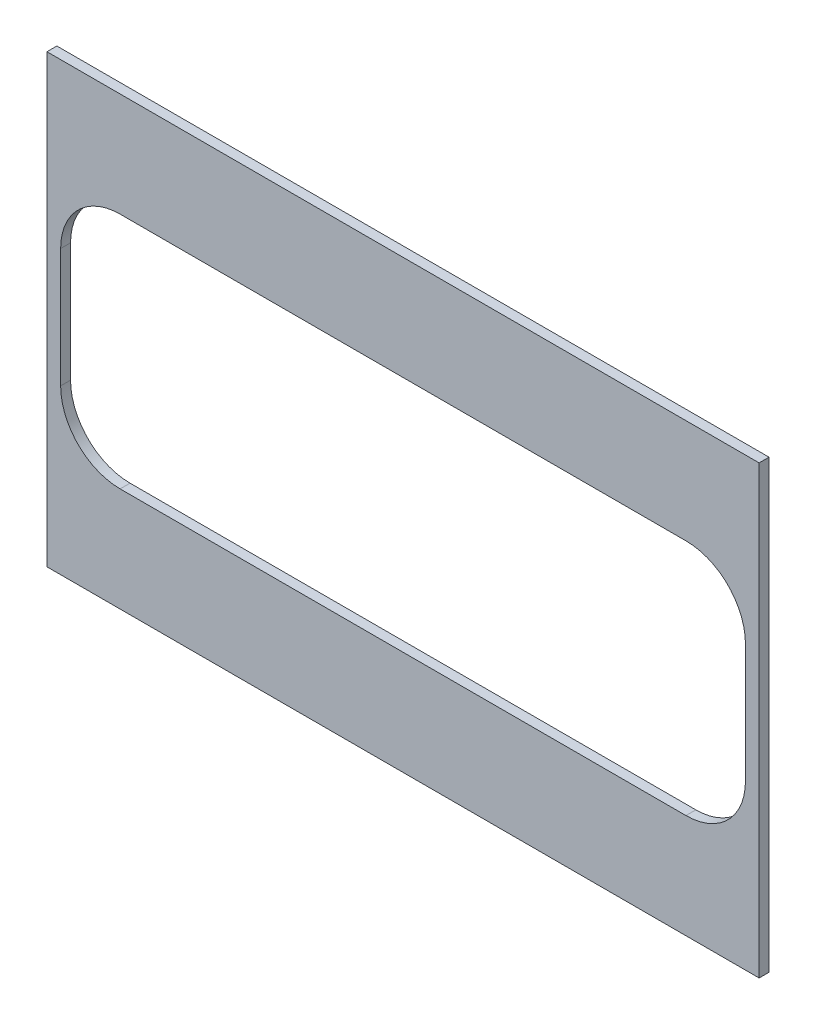
ISO-10303-21;
HEADER;
FILE_DESCRIPTION(('STEP AP214'),'2;1');
FILE_NAME('part.step','',(''),(''),'','','');
FILE_SCHEMA(('AUTOMOTIVE_DESIGN { 1 0 10303 214 1 1 1 1 }'));
ENDSEC;
DATA;
#1=APPLICATION_CONTEXT('core data for automotive mechanical design processes');
#2=APPLICATION_PROTOCOL_DEFINITION('international standard','automotive_design',2000,#1);
#3=PRODUCT_CONTEXT('',#1,'mechanical');
#4=PRODUCT('Part','Part','',(#3));
#5=PRODUCT_RELATED_PRODUCT_CATEGORY('part','',(#4));
#6=PRODUCT_DEFINITION_FORMATION('','',#4);
#7=PRODUCT_DEFINITION_CONTEXT('part definition',#1,'design');
#8=PRODUCT_DEFINITION('design','',#6,#7);
#9=PRODUCT_DEFINITION_SHAPE('','',#8);
#10=(LENGTH_UNIT() NAMED_UNIT(*) SI_UNIT(.MILLI.,.METRE.));
#11=(NAMED_UNIT(*) PLANE_ANGLE_UNIT() SI_UNIT($,.RADIAN.));
#12=(NAMED_UNIT(*) SI_UNIT($,.STERADIAN.) SOLID_ANGLE_UNIT());
#13=UNCERTAINTY_MEASURE_WITH_UNIT(LENGTH_MEASURE(1.E-05),#10,'distance_accuracy_value','');
#14=(GEOMETRIC_REPRESENTATION_CONTEXT(3) GLOBAL_UNCERTAINTY_ASSIGNED_CONTEXT((#13)) GLOBAL_UNIT_ASSIGNED_CONTEXT((#10,
#11,#12)) REPRESENTATION_CONTEXT('',''));
#15=CARTESIAN_POINT('',(0.,0.,0.));
#16=DIRECTION('',(0.,0.,1.));
#17=DIRECTION('',(1.,0.,0.));
#18=AXIS2_PLACEMENT_3D('',#15,#16,#17);
#19=CARTESIAN_POINT('',(-228.088766336441,1.74426445509468E-12,6.35));
#20=DIRECTION('',(1.,0.,0.));
#21=DIRECTION('',(0.,1.,0.));
#22=AXIS2_PLACEMENT_3D('',#19,#20,#21);
#23=PLANE('',#22);
#24=DIRECTION('',(0.,-1.,0.));
#25=VECTOR('',#24,1.);
#26=CARTESIAN_POINT('',(-228.088766336441,1.74426445509468E-12,0.));
#27=LINE('',#26,#25);
#28=CARTESIAN_POINT('',(-228.088766336441,1.74426445509468E-12,0.));
#29=VERTEX_POINT('',#28);
#30=CARTESIAN_POINT('',(-228.088766336441,-285.75,0.));
#31=VERTEX_POINT('',#30);
#32=EDGE_CURVE('E149',#29,#31,#27,.T.);
#33=ORIENTED_EDGE('',*,*,#32,.T.);
#34=DIRECTION('',(0.,0.,-1.));
#35=VECTOR('',#34,1.);
#36=CARTESIAN_POINT('',(-228.088766336441,-285.75,6.35));
#37=LINE('',#36,#35);
#38=CARTESIAN_POINT('',(-228.088766336441,-285.75,6.35));
#39=VERTEX_POINT('',#38);
#40=EDGE_CURVE('E130',#39,#31,#37,.T.);
#41=ORIENTED_EDGE('',*,*,#40,.F.);
#42=DIRECTION('',(0.,-1.,0.));
#43=VECTOR('',#42,1.);
#44=CARTESIAN_POINT('',(-228.088766336441,1.74426445509468E-12,6.35));
#45=LINE('',#44,#43);
#46=CARTESIAN_POINT('',(-228.088766336441,1.74426445509468E-12,6.35));
#47=VERTEX_POINT('',#46);
#48=EDGE_CURVE('E137',#47,#39,#45,.T.);
#49=ORIENTED_EDGE('',*,*,#48,.F.);
#50=DIRECTION('',(0.,0.,-1.));
#51=VECTOR('',#50,1.);
#52=CARTESIAN_POINT('',(-228.088766336441,1.74426445509468E-12,6.35));
#53=LINE('',#52,#51);
#54=EDGE_CURVE('E227',#47,#29,#53,.T.);
#55=ORIENTED_EDGE('',*,*,#54,.T.);
#56=EDGE_LOOP('',(#33,#41,#49,#55));
#57=FACE_BOUND('',#56,.T.);
#58=ADVANCED_FACE('F37',(#57),#23,.F.);
#59=CARTESIAN_POINT('',(-228.088766336441,-285.75,6.35));
#60=DIRECTION('',(0.,1.,0.));
#61=DIRECTION('',(0.,0.,1.));
#62=AXIS2_PLACEMENT_3D('',#59,#60,#61);
#63=PLANE('',#62);
#64=DIRECTION('',(1.,0.,0.));
#65=VECTOR('',#64,1.);
#66=CARTESIAN_POINT('',(-228.088766336441,-285.75,0.));
#67=LINE('',#66,#65);
#68=CARTESIAN_POINT('',(228.088766336441,-285.75,0.));
#69=VERTEX_POINT('',#68);
#70=EDGE_CURVE('E229',#31,#69,#67,.T.);
#71=ORIENTED_EDGE('',*,*,#70,.T.);
#72=DIRECTION('',(0.,0.,-1.));
#73=VECTOR('',#72,1.);
#74=CARTESIAN_POINT('',(228.088766336441,-285.75,6.35));
#75=LINE('',#74,#73);
#76=CARTESIAN_POINT('',(228.088766336441,-285.75,6.35));
#77=VERTEX_POINT('',#76);
#78=EDGE_CURVE('E133',#77,#69,#75,.T.);
#79=ORIENTED_EDGE('',*,*,#78,.F.);
#80=DIRECTION('',(1.,0.,0.));
#81=VECTOR('',#80,1.);
#82=CARTESIAN_POINT('',(-228.088766336441,-285.75,6.35));
#83=LINE('',#82,#81);
#84=EDGE_CURVE('E126',#39,#77,#83,.T.);
#85=ORIENTED_EDGE('',*,*,#84,.F.);
#86=ORIENTED_EDGE('',*,*,#40,.T.);
#87=EDGE_LOOP('',(#71,#79,#85,#86));
#88=FACE_BOUND('',#87,.T.);
#89=ADVANCED_FACE('F128',(#88),#63,.F.);
#90=CARTESIAN_POINT('',(228.088766336441,1.74426445509468E-12,6.35));
#91=DIRECTION('',(-1.,0.,0.));
#92=DIRECTION('',(0.,-1.,0.));
#93=AXIS2_PLACEMENT_3D('',#90,#91,#92);
#94=PLANE('',#93);
#95=DIRECTION('',(0.,1.,0.));
#96=VECTOR('',#95,1.);
#97=CARTESIAN_POINT('',(228.088766336441,1.74426445509468E-12,0.));
#98=LINE('',#97,#96);
#99=CARTESIAN_POINT('',(228.088766336441,1.74426445509468E-12,0.));
#100=VERTEX_POINT('',#99);
#101=EDGE_CURVE('E231',#69,#100,#98,.T.);
#102=ORIENTED_EDGE('',*,*,#101,.T.);
#103=DIRECTION('',(0.,0.,-1.));
#104=VECTOR('',#103,1.);
#105=CARTESIAN_POINT('',(228.088766336441,1.74426445509468E-12,6.35));
#106=LINE('',#105,#104);
#107=CARTESIAN_POINT('',(228.088766336441,1.74426445509468E-12,6.35));
#108=VERTEX_POINT('',#107);
#109=EDGE_CURVE('E154',#108,#100,#106,.T.);
#110=ORIENTED_EDGE('',*,*,#109,.F.);
#111=DIRECTION('',(0.,1.,0.));
#112=VECTOR('',#111,1.);
#113=CARTESIAN_POINT('',(228.088766336441,1.74426445509468E-12,6.35));
#114=LINE('',#113,#112);
#115=EDGE_CURVE('E136',#77,#108,#114,.T.);
#116=ORIENTED_EDGE('',*,*,#115,.F.);
#117=ORIENTED_EDGE('',*,*,#78,.T.);
#118=EDGE_LOOP('',(#102,#110,#116,#117));
#119=FACE_BOUND('',#118,.T.);
#120=ADVANCED_FACE('F241',(#119),#94,.F.);
#121=CARTESIAN_POINT('',(-228.088766336441,1.74426445509468E-12,6.35));
#122=DIRECTION('',(0.,-1.,0.));
#123=DIRECTION('',(0.,0.,-1.));
#124=AXIS2_PLACEMENT_3D('',#121,#122,#123);
#125=PLANE('',#124);
#126=DIRECTION('',(-1.,0.,0.));
#127=VECTOR('',#126,1.);
#128=CARTESIAN_POINT('',(-228.088766336441,1.74426445509468E-12,0.));
#129=LINE('',#128,#127);
#130=EDGE_CURVE('E146',#100,#29,#129,.T.);
#131=ORIENTED_EDGE('',*,*,#130,.T.);
#132=ORIENTED_EDGE('',*,*,#54,.F.);
#133=DIRECTION('',(-1.,0.,0.));
#134=VECTOR('',#133,1.);
#135=CARTESIAN_POINT('',(-228.088766336441,1.74426445509468E-12,6.35));
#136=LINE('',#135,#134);
#137=EDGE_CURVE('E142',#108,#47,#136,.T.);
#138=ORIENTED_EDGE('',*,*,#137,.F.);
#139=ORIENTED_EDGE('',*,*,#109,.T.);
#140=EDGE_LOOP('',(#131,#132,#138,#139));
#141=FACE_BOUND('',#140,.T.);
#142=ADVANCED_FACE('F238',(#141),#125,.F.);
#143=CARTESIAN_POINT('',(0.,0.,6.35));
#144=DIRECTION('',(0.,0.,1.));
#145=DIRECTION('',(1.,0.,0.));
#146=AXIS2_PLACEMENT_3D('',#143,#144,#145);
#147=PLANE('',#146);
#148=DIRECTION('',(0.,1.,0.));
#149=VECTOR('',#148,1.);
#150=CARTESIAN_POINT('',(219.325766336441,-219.075,6.35));
#151=LINE('',#150,#149);
#152=CARTESIAN_POINT('',(219.325766336441,-180.975,6.35));
#153=VERTEX_POINT('',#152);
#154=CARTESIAN_POINT('',(219.325766336441,-104.775,6.35));
#155=VERTEX_POINT('',#154);
#156=EDGE_CURVE('E194',#153,#155,#151,.T.);
#157=ORIENTED_EDGE('',*,*,#156,.F.);
#158=CARTESIAN_POINT('',(181.225766336441,-180.975,6.35));
#159=DIRECTION('',(0.,0.,1.));
#160=DIRECTION('',(1.,0.,0.));
#161=AXIS2_PLACEMENT_3D('',#158,#159,#160);
#162=CIRCLE('',#161,38.1);
#163=CARTESIAN_POINT('',(181.225766336441,-219.075,6.35));
#164=VERTEX_POINT('',#163);
#165=EDGE_CURVE('E178',#153,#164,#162,.F.);
#166=ORIENTED_EDGE('',*,*,#165,.T.);
#167=DIRECTION('',(1.,0.,0.));
#168=VECTOR('',#167,1.);
#169=CARTESIAN_POINT('',(-219.325766336441,-219.075,6.35));
#170=LINE('',#169,#168);
#171=CARTESIAN_POINT('',(-181.225766336441,-219.075,6.35));
#172=VERTEX_POINT('',#171);
#173=EDGE_CURVE('E220',#172,#164,#170,.T.);
#174=ORIENTED_EDGE('',*,*,#173,.F.);
#175=CARTESIAN_POINT('',(-181.225766336441,-180.975,6.35));
#176=DIRECTION('',(0.,0.,1.));
#177=DIRECTION('',(1.,0.,0.));
#178=AXIS2_PLACEMENT_3D('',#175,#176,#177);
#179=CIRCLE('',#178,38.1);
#180=CARTESIAN_POINT('',(-219.325766336441,-180.975,6.35));
#181=VERTEX_POINT('',#180);
#182=EDGE_CURVE('E52',#172,#181,#179,.F.);
#183=ORIENTED_EDGE('',*,*,#182,.T.);
#184=DIRECTION('',(0.,-1.,0.));
#185=VECTOR('',#184,1.);
#186=CARTESIAN_POINT('',(-219.325766336441,-219.075,6.35));
#187=LINE('',#186,#185);
#188=CARTESIAN_POINT('',(-219.325766336441,-104.775,6.35));
#189=VERTEX_POINT('',#188);
#190=EDGE_CURVE('E188',#189,#181,#187,.T.);
#191=ORIENTED_EDGE('',*,*,#190,.F.);
#192=CARTESIAN_POINT('',(-181.225766336441,-104.775,6.35));
#193=DIRECTION('',(0.,0.,1.));
#194=DIRECTION('',(1.,0.,0.));
#195=AXIS2_PLACEMENT_3D('',#192,#193,#194);
#196=CIRCLE('',#195,38.1);
#197=CARTESIAN_POINT('',(-181.225766336441,-66.675,6.35));
#198=VERTEX_POINT('',#197);
#199=EDGE_CURVE('E45',#189,#198,#196,.F.);
#200=ORIENTED_EDGE('',*,*,#199,.T.);
#201=DIRECTION('',(-1.,0.,0.));
#202=VECTOR('',#201,1.);
#203=CARTESIAN_POINT('',(-219.325766336441,-66.675,6.35));
#204=LINE('',#203,#202);
#205=CARTESIAN_POINT('',(181.225766336441,-66.675,6.35));
#206=VERTEX_POINT('',#205);
#207=EDGE_CURVE('E187',#206,#198,#204,.T.);
#208=ORIENTED_EDGE('',*,*,#207,.F.);
#209=CARTESIAN_POINT('',(181.225766336441,-104.775,6.35));
#210=DIRECTION('',(0.,0.,1.));
#211=DIRECTION('',(1.,0.,0.));
#212=AXIS2_PLACEMENT_3D('',#209,#210,#211);
#213=CIRCLE('',#212,38.1);
#214=EDGE_CURVE('E174',#206,#155,#213,.F.);
#215=ORIENTED_EDGE('',*,*,#214,.T.);
#216=EDGE_LOOP('',(#157,#166,#174,#183,#191,#200,#208,#215));
#217=FACE_BOUND('',#216,.T.);
#218=ORIENTED_EDGE('',*,*,#48,.T.);
#219=ORIENTED_EDGE('',*,*,#84,.T.);
#220=ORIENTED_EDGE('',*,*,#115,.T.);
#221=ORIENTED_EDGE('',*,*,#137,.T.);
#222=EDGE_LOOP('',(#218,#219,#220,#221));
#223=FACE_BOUND('',#222,.T.);
#224=ADVANCED_FACE('F140',(#217,#223),#147,.T.);
#225=CARTESIAN_POINT('',(0.,0.,0.));
#226=DIRECTION('',(0.,0.,1.));
#227=DIRECTION('',(1.,0.,0.));
#228=AXIS2_PLACEMENT_3D('',#225,#226,#227);
#229=PLANE('',#228);
#230=DIRECTION('',(-1.,0.,0.));
#231=VECTOR('',#230,1.);
#232=CARTESIAN_POINT('',(-219.325766336441,-219.075,0.));
#233=LINE('',#232,#231);
#234=CARTESIAN_POINT('',(181.225766336441,-219.075,0.));
#235=VERTEX_POINT('',#234);
#236=CARTESIAN_POINT('',(-181.225766336441,-219.075,0.));
#237=VERTEX_POINT('',#236);
#238=EDGE_CURVE('E209',#235,#237,#233,.T.);
#239=ORIENTED_EDGE('',*,*,#238,.F.);
#240=CARTESIAN_POINT('',(181.225766336441,-180.975,0.));
#241=DIRECTION('',(0.,0.,1.));
#242=DIRECTION('',(1.,0.,0.));
#243=AXIS2_PLACEMENT_3D('',#240,#241,#242);
#244=CIRCLE('',#243,38.1);
#245=CARTESIAN_POINT('',(219.325766336441,-180.975,0.));
#246=VERTEX_POINT('',#245);
#247=EDGE_CURVE('E180',#235,#246,#244,.T.);
#248=ORIENTED_EDGE('',*,*,#247,.T.);
#249=DIRECTION('',(0.,-1.,0.));
#250=VECTOR('',#249,1.);
#251=CARTESIAN_POINT('',(219.325766336441,-219.075,0.));
#252=LINE('',#251,#250);
#253=CARTESIAN_POINT('',(219.325766336441,-104.775,0.));
#254=VERTEX_POINT('',#253);
#255=EDGE_CURVE('E212',#254,#246,#252,.T.);
#256=ORIENTED_EDGE('',*,*,#255,.F.);
#257=CARTESIAN_POINT('',(181.225766336441,-104.775,0.));
#258=DIRECTION('',(0.,0.,1.));
#259=DIRECTION('',(1.,0.,0.));
#260=AXIS2_PLACEMENT_3D('',#257,#258,#259);
#261=CIRCLE('',#260,38.1);
#262=CARTESIAN_POINT('',(181.225766336441,-66.675,0.));
#263=VERTEX_POINT('',#262);
#264=EDGE_CURVE('E176',#254,#263,#261,.T.);
#265=ORIENTED_EDGE('',*,*,#264,.T.);
#266=DIRECTION('',(1.,0.,0.));
#267=VECTOR('',#266,1.);
#268=CARTESIAN_POINT('',(-219.325766336441,-66.675,0.));
#269=LINE('',#268,#267);
#270=CARTESIAN_POINT('',(-181.225766336441,-66.675,0.));
#271=VERTEX_POINT('',#270);
#272=EDGE_CURVE('E205',#271,#263,#269,.T.);
#273=ORIENTED_EDGE('',*,*,#272,.F.);
#274=CARTESIAN_POINT('',(-181.225766336441,-104.775,0.));
#275=DIRECTION('',(0.,0.,1.));
#276=DIRECTION('',(1.,0.,0.));
#277=AXIS2_PLACEMENT_3D('',#274,#275,#276);
#278=CIRCLE('',#277,38.1);
#279=CARTESIAN_POINT('',(-219.325766336441,-104.775,0.));
#280=VERTEX_POINT('',#279);
#281=EDGE_CURVE('E11',#271,#280,#278,.T.);
#282=ORIENTED_EDGE('',*,*,#281,.T.);
#283=DIRECTION('',(0.,1.,0.));
#284=VECTOR('',#283,1.);
#285=CARTESIAN_POINT('',(-219.325766336441,-219.075,0.));
#286=LINE('',#285,#284);
#287=CARTESIAN_POINT('',(-219.325766336441,-180.975,0.));
#288=VERTEX_POINT('',#287);
#289=EDGE_CURVE('E203',#288,#280,#286,.T.);
#290=ORIENTED_EDGE('',*,*,#289,.F.);
#291=CARTESIAN_POINT('',(-181.225766336441,-180.975,0.));
#292=DIRECTION('',(0.,0.,1.));
#293=DIRECTION('',(1.,0.,0.));
#294=AXIS2_PLACEMENT_3D('',#291,#292,#293);
#295=CIRCLE('',#294,38.1);
#296=EDGE_CURVE('E183',#288,#237,#295,.T.);
#297=ORIENTED_EDGE('',*,*,#296,.T.);
#298=EDGE_LOOP('',(#239,#248,#256,#265,#273,#282,#290,#297));
#299=FACE_BOUND('',#298,.T.);
#300=ORIENTED_EDGE('',*,*,#32,.F.);
#301=ORIENTED_EDGE('',*,*,#130,.F.);
#302=ORIENTED_EDGE('',*,*,#101,.F.);
#303=ORIENTED_EDGE('',*,*,#70,.F.);
#304=EDGE_LOOP('',(#300,#301,#302,#303));
#305=FACE_BOUND('',#304,.T.);
#306=ADVANCED_FACE('F201',(#299,#305),#229,.F.);
#307=CARTESIAN_POINT('',(219.325766336441,-219.075,-0.00100000000000013));
#308=DIRECTION('',(1.,0.,0.));
#309=DIRECTION('',(0.,0.,-1.));
#310=AXIS2_PLACEMENT_3D('',#307,#308,#309);
#311=PLANE('',#310);
#312=ORIENTED_EDGE('',*,*,#156,.T.);
#313=DIRECTION('',(0.,0.,1.));
#314=VECTOR('',#313,1.);
#315=CARTESIAN_POINT('',(219.325766336441,-104.775,0.));
#316=LINE('',#315,#314);
#317=EDGE_CURVE('E163',#155,#254,#316,.F.);
#318=ORIENTED_EDGE('',*,*,#317,.T.);
#319=ORIENTED_EDGE('',*,*,#255,.T.);
#320=DIRECTION('',(0.,0.,1.));
#321=VECTOR('',#320,1.);
#322=CARTESIAN_POINT('',(219.325766336441,-180.975,6.35));
#323=LINE('',#322,#321);
#324=EDGE_CURVE('E160',#246,#153,#323,.T.);
#325=ORIENTED_EDGE('',*,*,#324,.T.);
#326=EDGE_LOOP('',(#312,#318,#319,#325));
#327=FACE_BOUND('',#326,.T.);
#328=ADVANCED_FACE('F277',(#327),#311,.F.);
#329=CARTESIAN_POINT('',(-219.325766336441,-219.075,-0.00100000000000013));
#330=DIRECTION('',(0.,-1.,0.));
#331=DIRECTION('',(0.,0.,-1.));
#332=AXIS2_PLACEMENT_3D('',#329,#330,#331);
#333=PLANE('',#332);
#334=ORIENTED_EDGE('',*,*,#173,.T.);
#335=DIRECTION('',(0.,0.,1.));
#336=VECTOR('',#335,1.);
#337=CARTESIAN_POINT('',(181.225766336441,-219.075,0.));
#338=LINE('',#337,#336);
#339=EDGE_CURVE('E168',#164,#235,#338,.F.);
#340=ORIENTED_EDGE('',*,*,#339,.T.);
#341=ORIENTED_EDGE('',*,*,#238,.T.);
#342=DIRECTION('',(0.,0.,1.));
#343=VECTOR('',#342,1.);
#344=CARTESIAN_POINT('',(-181.225766336441,-219.075,6.35));
#345=LINE('',#344,#343);
#346=EDGE_CURVE('E165',#237,#172,#345,.T.);
#347=ORIENTED_EDGE('',*,*,#346,.T.);
#348=EDGE_LOOP('',(#334,#340,#341,#347));
#349=FACE_BOUND('',#348,.T.);
#350=ADVANCED_FACE('F271',(#349),#333,.F.);
#351=CARTESIAN_POINT('',(-219.325766336441,-219.075,-0.00100000000000013));
#352=DIRECTION('',(-1.,0.,0.));
#353=DIRECTION('',(0.,0.,1.));
#354=AXIS2_PLACEMENT_3D('',#351,#352,#353);
#355=PLANE('',#354);
#356=ORIENTED_EDGE('',*,*,#190,.T.);
#357=DIRECTION('',(0.,0.,1.));
#358=VECTOR('',#357,1.);
#359=CARTESIAN_POINT('',(-219.325766336441,-180.975,0.));
#360=LINE('',#359,#358);
#361=EDGE_CURVE('E172',#181,#288,#360,.F.);
#362=ORIENTED_EDGE('',*,*,#361,.T.);
#363=ORIENTED_EDGE('',*,*,#289,.T.);
#364=DIRECTION('',(0.,0.,1.));
#365=VECTOR('',#364,1.);
#366=CARTESIAN_POINT('',(-219.325766336441,-104.775,6.35));
#367=LINE('',#366,#365);
#368=EDGE_CURVE('E170',#280,#189,#367,.T.);
#369=ORIENTED_EDGE('',*,*,#368,.T.);
#370=EDGE_LOOP('',(#356,#362,#363,#369));
#371=FACE_BOUND('',#370,.T.);
#372=ADVANCED_FACE('F207',(#371),#355,.F.);
#373=CARTESIAN_POINT('',(-219.325766336441,-66.675,-0.00100000000000013));
#374=DIRECTION('',(0.,1.,0.));
#375=DIRECTION('',(0.,0.,1.));
#376=AXIS2_PLACEMENT_3D('',#373,#374,#375);
#377=PLANE('',#376);
#378=ORIENTED_EDGE('',*,*,#272,.T.);
#379=DIRECTION('',(0.,0.,1.));
#380=VECTOR('',#379,1.);
#381=CARTESIAN_POINT('',(181.225766336441,-66.675,6.35));
#382=LINE('',#381,#380);
#383=EDGE_CURVE('E152',#263,#206,#382,.T.);
#384=ORIENTED_EDGE('',*,*,#383,.T.);
#385=ORIENTED_EDGE('',*,*,#207,.T.);
#386=DIRECTION('',(0.,0.,1.));
#387=VECTOR('',#386,1.);
#388=CARTESIAN_POINT('',(-181.225766336441,-66.675,0.));
#389=LINE('',#388,#387);
#390=EDGE_CURVE('E150',#198,#271,#389,.F.);
#391=ORIENTED_EDGE('',*,*,#390,.T.);
#392=EDGE_LOOP('',(#378,#384,#385,#391));
#393=FACE_BOUND('',#392,.T.);
#394=ADVANCED_FACE('F191',(#393),#377,.F.);
#395=CARTESIAN_POINT('',(181.225766336441,-104.775,-0.00100000000000013));
#396=DIRECTION('',(0.,0.,-1.));
#397=DIRECTION('',(-1.,0.,0.));
#398=AXIS2_PLACEMENT_3D('',#395,#396,#397);
#399=CYLINDRICAL_SURFACE('',#398,38.1);
#400=ORIENTED_EDGE('',*,*,#264,.F.);
#401=ORIENTED_EDGE('',*,*,#317,.F.);
#402=ORIENTED_EDGE('',*,*,#214,.F.);
#403=ORIENTED_EDGE('',*,*,#383,.F.);
#404=EDGE_LOOP('',(#400,#401,#402,#403));
#405=FACE_BOUND('',#404,.T.);
#406=ADVANCED_FACE('F255',(#405),#399,.F.);
#407=CARTESIAN_POINT('',(181.225766336441,-180.975,-0.00100000000000013));
#408=DIRECTION('',(0.,0.,-1.));
#409=DIRECTION('',(-1.,0.,0.));
#410=AXIS2_PLACEMENT_3D('',#407,#408,#409);
#411=CYLINDRICAL_SURFACE('',#410,38.1);
#412=ORIENTED_EDGE('',*,*,#247,.F.);
#413=ORIENTED_EDGE('',*,*,#339,.F.);
#414=ORIENTED_EDGE('',*,*,#165,.F.);
#415=ORIENTED_EDGE('',*,*,#324,.F.);
#416=EDGE_LOOP('',(#412,#413,#414,#415));
#417=FACE_BOUND('',#416,.T.);
#418=ADVANCED_FACE('F258',(#417),#411,.F.);
#419=CARTESIAN_POINT('',(-181.225766336441,-180.975,-0.00100000000000013));
#420=DIRECTION('',(0.,0.,-1.));
#421=DIRECTION('',(-1.,0.,0.));
#422=AXIS2_PLACEMENT_3D('',#419,#420,#421);
#423=CYLINDRICAL_SURFACE('',#422,38.1);
#424=ORIENTED_EDGE('',*,*,#296,.F.);
#425=ORIENTED_EDGE('',*,*,#361,.F.);
#426=ORIENTED_EDGE('',*,*,#182,.F.);
#427=ORIENTED_EDGE('',*,*,#346,.F.);
#428=EDGE_LOOP('',(#424,#425,#426,#427));
#429=FACE_BOUND('',#428,.T.);
#430=ADVANCED_FACE('F261',(#429),#423,.F.);
#431=CARTESIAN_POINT('',(-181.225766336441,-104.775,-0.00100000000000013));
#432=DIRECTION('',(0.,0.,-1.));
#433=DIRECTION('',(-1.,0.,0.));
#434=AXIS2_PLACEMENT_3D('',#431,#432,#433);
#435=CYLINDRICAL_SURFACE('',#434,38.1);
#436=ORIENTED_EDGE('',*,*,#281,.F.);
#437=ORIENTED_EDGE('',*,*,#390,.F.);
#438=ORIENTED_EDGE('',*,*,#199,.F.);
#439=ORIENTED_EDGE('',*,*,#368,.F.);
#440=EDGE_LOOP('',(#436,#437,#438,#439));
#441=FACE_BOUND('',#440,.T.);
#442=ADVANCED_FACE('F39',(#441),#435,.F.);
#443=CLOSED_SHELL('',(#58,#89,#120,#142,#224,#306,#328,#350,#372,#394,#406,#418,#430,#442));
#444=MANIFOLD_SOLID_BREP('B2',#443);
#445=ADVANCED_BREP_SHAPE_REPRESENTATION('',(#18,#444),#14);
#446=SHAPE_DEFINITION_REPRESENTATION(#9,#445);
ENDSEC;
END-ISO-10303-21;
